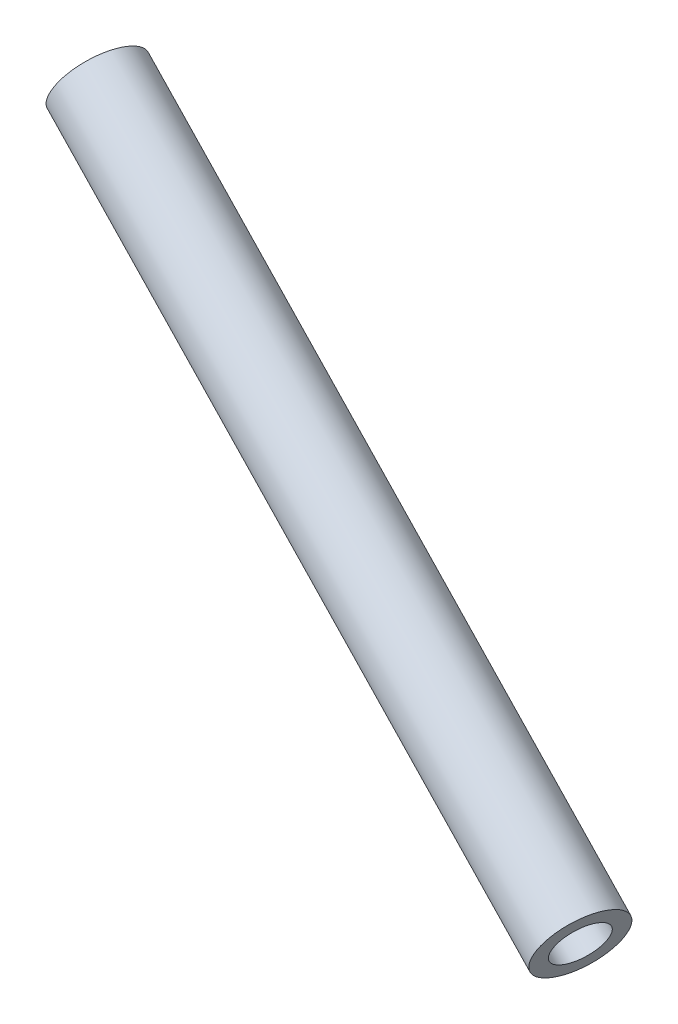
ISO-10303-21;
HEADER;
FILE_DESCRIPTION(('STEP AP214'),'2;1');
FILE_NAME('part.step','',(''),(''),'','','');
FILE_SCHEMA(('AUTOMOTIVE_DESIGN { 1 0 10303 214 1 1 1 1 }'));
ENDSEC;
DATA;
#1=APPLICATION_CONTEXT('core data for automotive mechanical design processes');
#2=APPLICATION_PROTOCOL_DEFINITION('international standard','automotive_design',2000,#1);
#3=PRODUCT_CONTEXT('',#1,'mechanical');
#4=PRODUCT('Part','Part','',(#3));
#5=PRODUCT_RELATED_PRODUCT_CATEGORY('part','',(#4));
#6=PRODUCT_DEFINITION_FORMATION('','',#4);
#7=PRODUCT_DEFINITION_CONTEXT('part definition',#1,'design');
#8=PRODUCT_DEFINITION('design','',#6,#7);
#9=PRODUCT_DEFINITION_SHAPE('','',#8);
#10=(LENGTH_UNIT() NAMED_UNIT(*) SI_UNIT(.MILLI.,.METRE.));
#11=(NAMED_UNIT(*) PLANE_ANGLE_UNIT() SI_UNIT($,.RADIAN.));
#12=(NAMED_UNIT(*) SI_UNIT($,.STERADIAN.) SOLID_ANGLE_UNIT());
#13=UNCERTAINTY_MEASURE_WITH_UNIT(LENGTH_MEASURE(1.E-05),#10,'distance_accuracy_value','');
#14=(GEOMETRIC_REPRESENTATION_CONTEXT(3) GLOBAL_UNCERTAINTY_ASSIGNED_CONTEXT((#13)) GLOBAL_UNIT_ASSIGNED_CONTEXT((#10,
#11,#12)) REPRESENTATION_CONTEXT('',''));
#15=CARTESIAN_POINT('',(0.,0.,0.));
#16=DIRECTION('',(0.,0.,1.));
#17=DIRECTION('',(1.,0.,0.));
#18=AXIS2_PLACEMENT_3D('',#15,#16,#17);
#19=CARTESIAN_POINT('',(-74.444753684597,97.0848251686542,-12.9025849114731));
#20=DIRECTION('',(0.869739963853115,-0.435019425763826,0.233046120939381));
#21=DIRECTION('',(-0.447336531418005,-0.894365712479469,0.));
#22=AXIS2_PLACEMENT_3D('',#19,#20,#21);
#23=CYLINDRICAL_SURFACE('',#22,2.5);
#24=CARTESIAN_POINT('',(-74.444753684597,97.0848251686542,-12.9025849114731));
#25=DIRECTION('',(0.869739963853115,-0.435019425763826,0.233046120939381));
#26=DIRECTION('',(0.447336531418005,0.894365712479469,0.));
#27=AXIS2_PLACEMENT_3D('',#24,#25,#26);
#28=CIRCLE('',#27,2.5);
#29=CARTESIAN_POINT('',(-73.326412356052,99.3207394498528,-12.9025849114731));
#30=VERTEX_POINT('',#29);
#31=EDGE_CURVE('E10',#30,#30,#28,.T.);
#32=ORIENTED_EDGE('',*,*,#31,.T.);
#33=EDGE_LOOP('',(#32));
#34=FACE_BOUND('',#33,.T.);
#35=CARTESIAN_POINT('',(-34.1193109206581,76.9151748318745,-2.09741508845444));
#36=DIRECTION('',(0.869739963853115,-0.435019425763826,0.233046120939381));
#37=DIRECTION('',(0.447336531418005,0.894365712479469,0.));
#38=AXIS2_PLACEMENT_3D('',#35,#36,#37);
#39=CIRCLE('',#38,2.5);
#40=CARTESIAN_POINT('',(-33.0009695921131,79.1510891130731,-2.09741508845444));
#41=VERTEX_POINT('',#40);
#42=EDGE_CURVE('E46',#41,#41,#39,.T.);
#43=ORIENTED_EDGE('',*,*,#42,.F.);
#44=EDGE_LOOP('',(#43));
#45=FACE_BOUND('',#44,.T.);
#46=ADVANCED_FACE('F39',(#34,#45),#23,.T.);
#47=CARTESIAN_POINT('',(-74.444753684597,97.0848251686542,-12.9025849114731));
#48=DIRECTION('',(-0.869739963853115,0.435019425763826,-0.233046120939381));
#49=DIRECTION('',(0.447336531418005,0.894365712479469,0.));
#50=AXIS2_PLACEMENT_3D('',#47,#48,#49);
#51=PLANE('',#50);
#52=CARTESIAN_POINT('',(-74.444753684597,97.0848251686542,-12.9025849114731));
#53=DIRECTION('',(0.869739963853115,-0.435019425763826,0.233046120939381));
#54=DIRECTION('',(0.447336531418005,0.894365712479469,0.));
#55=AXIS2_PLACEMENT_3D('',#52,#53,#54);
#56=CIRCLE('',#55,1.55);
#57=CARTESIAN_POINT('',(-75.1381253082949,95.698558314311,-12.9025849114731));
#58=VERTEX_POINT('',#57);
#59=EDGE_CURVE('E51',#58,#58,#56,.F.);
#60=ORIENTED_EDGE('',*,*,#59,.F.);
#61=EDGE_LOOP('',(#60));
#62=FACE_BOUND('',#61,.T.);
#63=ORIENTED_EDGE('',*,*,#31,.F.);
#64=EDGE_LOOP('',(#63));
#65=FACE_BOUND('',#64,.T.);
#66=ADVANCED_FACE('F70',(#62,#65),#51,.T.);
#67=CARTESIAN_POINT('',(-34.1193109206581,76.9151748318745,-2.09741508845444));
#68=DIRECTION('',(-0.869739963853115,0.435019425763826,-0.233046120939381));
#69=DIRECTION('',(0.447336531418005,0.894365712479469,0.));
#70=AXIS2_PLACEMENT_3D('',#67,#68,#69);
#71=PLANE('',#70);
#72=CARTESIAN_POINT('',(-34.1193109206581,76.9151748318745,-2.09741508845443));
#73=DIRECTION('',(0.869739963853115,-0.435019425763826,0.233046120939381));
#74=DIRECTION('',(0.447336531418005,0.894365712479469,0.));
#75=AXIS2_PLACEMENT_3D('',#72,#73,#74);
#76=CIRCLE('',#75,1.55);
#77=CARTESIAN_POINT('',(-34.812682544356,75.5289079775313,-2.09741508845443));
#78=VERTEX_POINT('',#77);
#79=EDGE_CURVE('E45',#78,#78,#76,.F.);
#80=ORIENTED_EDGE('',*,*,#79,.T.);
#81=EDGE_LOOP('',(#80));
#82=FACE_BOUND('',#81,.T.);
#83=ORIENTED_EDGE('',*,*,#42,.T.);
#84=EDGE_LOOP('',(#83));
#85=FACE_BOUND('',#84,.T.);
#86=ADVANCED_FACE('F56',(#82,#85),#71,.F.);
#87=CARTESIAN_POINT('',(-74.5317276809823,97.1283271112306,-12.925889523567));
#88=DIRECTION('',(0.869739963853115,-0.435019425763827,0.233046120939381));
#89=DIRECTION('',(-0.447336531418006,-0.894365712479469,0.));
#90=AXIS2_PLACEMENT_3D('',#87,#88,#89);
#91=CYLINDRICAL_SURFACE('',#90,1.55);
#92=CARTESIAN_POINT('',(-75.1381253082949,95.698558314311,-12.9025849114731));
#93=CARTESIAN_POINT('',(-74.7180686128372,95.4884577899696,-12.79003105915));
#94=CARTESIAN_POINT('',(-74.2980119173795,95.2783572656281,-12.6774772068268));
#95=CARTESIAN_POINT('',(-73.4578985264641,94.8581562169452,-12.4523695021806));
#96=CARTESIAN_POINT('',(-73.0378418310064,94.6480556926037,-12.3398156498575));
#97=CARTESIAN_POINT('',(-72.197728440091,94.2278546439208,-12.1147079452113));
#98=CARTESIAN_POINT('',(-71.7776717446333,94.0177541195794,-12.0021540928882));
#99=CARTESIAN_POINT('',(-70.9375583537179,93.5975530708965,-11.777046388242));
#100=CARTESIAN_POINT('',(-70.5175016582602,93.387452546555,-11.6644925359188));
#101=CARTESIAN_POINT('',(-69.6773882673449,92.9672514978721,-11.4393848312726));
#102=CARTESIAN_POINT('',(-69.2573315718871,92.7571509735306,-11.3268309789495));
#103=CARTESIAN_POINT('',(-68.4172181809718,92.3369499248477,-11.1017232743033));
#104=CARTESIAN_POINT('',(-67.997161485514,92.1268494005063,-10.9891694219802));
#105=CARTESIAN_POINT('',(-67.1570480945987,91.7066483518234,-10.764061717334));
#106=CARTESIAN_POINT('',(-66.736991399141,91.4965478274819,-10.6515078650108));
#107=CARTESIAN_POINT('',(-65.8968780082256,91.076346778799,-10.4264001603646));
#108=CARTESIAN_POINT('',(-65.4768213127679,90.8662462544575,-10.3138463080415));
#109=CARTESIAN_POINT('',(-64.6367079218525,90.4460452057746,-10.0887386033953));
#110=CARTESIAN_POINT('',(-64.2166512263948,90.2359446814332,-9.97618475107218));
#111=CARTESIAN_POINT('',(-63.3765378354794,89.8157436327503,-9.75107704642596));
#112=CARTESIAN_POINT('',(-62.9564811400217,89.6056431084088,-9.63852319410285));
#113=CARTESIAN_POINT('',(-62.1163677491063,89.1854420597259,-9.41341548945663));
#114=CARTESIAN_POINT('',(-61.6963110536486,88.9753415353844,-9.30086163713352));
#115=CARTESIAN_POINT('',(-60.8561976627332,88.5551404867015,-9.0757539324873));
#116=CARTESIAN_POINT('',(-60.4361409672755,88.3450399623601,-8.96320008016419));
#117=CARTESIAN_POINT('',(-59.5960275763601,87.9248389136772,-8.73809237551797));
#118=CARTESIAN_POINT('',(-59.1759708809024,87.7147383893357,-8.62553852319485));
#119=CARTESIAN_POINT('',(-58.335857489987,87.2945373406528,-8.40043081854863));
#120=CARTESIAN_POINT('',(-57.9158007945293,87.0844368163113,-8.28787696622552));
#121=CARTESIAN_POINT('',(-57.0756874036139,86.6642357676284,-8.0627692615793));
#122=CARTESIAN_POINT('',(-56.6556307081562,86.454135243287,-7.95021540925619));
#123=CARTESIAN_POINT('',(-55.8155173172408,86.0339341946041,-7.72510770460997));
#124=CARTESIAN_POINT('',(-55.3954606217831,85.8238336702626,-7.61255385228686));
#125=CARTESIAN_POINT('',(-54.5553472308677,85.4036326215797,-7.38744614764064));
#126=CARTESIAN_POINT('',(-54.13529053541,85.1935320972382,-7.27489229531753));
#127=CARTESIAN_POINT('',(-53.2951771444946,84.7733310485553,-7.0497845906713));
#128=CARTESIAN_POINT('',(-52.8751204490369,84.5632305242139,-6.93723073834819));
#129=CARTESIAN_POINT('',(-52.0350070581216,84.143029475531,-6.71212303370197));
#130=CARTESIAN_POINT('',(-51.6149503626639,83.9329289511895,-6.59956918137886));
#131=CARTESIAN_POINT('',(-50.7748369717485,83.5127279025066,-6.37446147673264));
#132=CARTESIAN_POINT('',(-50.3547802762908,83.3026273781651,-6.26190762440953));
#133=CARTESIAN_POINT('',(-49.5146668853754,82.8824263294822,-6.03679991976331));
#134=CARTESIAN_POINT('',(-49.0946101899177,82.6723258051408,-5.9242460674402));
#135=CARTESIAN_POINT('',(-48.2544967990023,82.2521247564579,-5.69913836279397));
#136=CARTESIAN_POINT('',(-47.8344401035446,82.0420242321164,-5.58658451047086));
#137=CARTESIAN_POINT('',(-46.9943267126292,81.6218231834335,-5.36147680582464));
#138=CARTESIAN_POINT('',(-46.5742700171715,81.411722659092,-5.24892295350153));
#139=CARTESIAN_POINT('',(-45.7341566262561,80.9915216104091,-5.02381524885531));
#140=CARTESIAN_POINT('',(-45.3140999307984,80.7814210860677,-4.9112613965322));
#141=CARTESIAN_POINT('',(-44.473986539883,80.3612200373848,-4.68615369188598));
#142=CARTESIAN_POINT('',(-44.0539298444253,80.1511195130433,-4.57359983956287));
#143=CARTESIAN_POINT('',(-43.2138164535099,79.7309184643604,-4.34849213491665));
#144=CARTESIAN_POINT('',(-42.7937597580522,79.5208179400189,-4.23593828259354));
#145=CARTESIAN_POINT('',(-41.9536463671368,79.100616891336,-4.01083057794731));
#146=CARTESIAN_POINT('',(-41.5335896716791,78.8905163669946,-3.8982767256242));
#147=CARTESIAN_POINT('',(-40.6934762807637,78.4703153183117,-3.67316902097798));
#148=CARTESIAN_POINT('',(-40.273419585306,78.2602147939702,-3.56061516865487));
#149=CARTESIAN_POINT('',(-39.4333061943906,77.8400137452873,-3.33550746400865));
#150=CARTESIAN_POINT('',(-39.0132494989329,77.6299132209458,-3.22295361168554));
#151=CARTESIAN_POINT('',(-38.1731361080175,77.2097121722629,-2.99784590703932));
#152=CARTESIAN_POINT('',(-37.7530794125598,76.9996116479215,-2.88529205471621));
#153=CARTESIAN_POINT('',(-36.9129660216445,76.5794105992386,-2.66018435006999));
#154=CARTESIAN_POINT('',(-36.4929093261867,76.3693100748971,-2.54763049774687));
#155=CARTESIAN_POINT('',(-35.6527959352714,75.9491090262142,-2.32252279310065));
#156=CARTESIAN_POINT('',(-35.2327392398137,75.7390085018727,-2.20996894077754));
#157=CARTESIAN_POINT('',(-34.812682544356,75.5289079775313,-2.09741508845443));
#158=B_SPLINE_CURVE_WITH_KNOTS('',3,(#92,#93,#94,#95,#96,#97,#98,#99,#100,#101,#102,#103,#104,
#105,#106,#107,#108,#109,#110,#111,#112,#113,#114,#115,#116,#117,#118,#119,#120,#121,#122,#123,
#124,#125,#126,#127,#128,#129,#130,#131,#132,#133,#134,#135,#136,#137,#138,#139,#140,#141,#142,
#143,#144,#145,#146,#147,#148,#149,#150,#151,#152,#153,#154,#155,#156,#157),.UNSPECIFIED.,.F.,
.F.,(4,2,2,2,2,2,2,2,2,2,2,2,2,2,2,2,2,2,2,2,2,2,2,2,2,2,2,2,2,2,2,2,4),(0.,1.44890442976807,
2.89780885953613,4.34671328930419,5.79561771907225,7.24452214884032,8.69342657860838,
10.1423310083764,11.5912354381445,13.0401398679126,14.4890442976806,15.9379487274487,
17.3868531572168,18.8357575869848,20.2846620167529,21.7335664465209,23.182470876289,
24.6313753060571,26.0802797358251,27.5291841655932,28.9780885953612,30.4269930251293,
31.8758974548974,33.3248018846654,34.7737063144335,36.2226107442016,37.6715151739696,
39.1204196037377,40.5693240335057,42.0182284632738,43.4671328930419,44.9160373228099,
46.364941752578),.UNSPECIFIED.);
#159=EDGE_CURVE('BSEAM62',#58,#78,#158,.T.);
#160=ORIENTED_EDGE('',*,*,#59,.T.);
#161=ORIENTED_EDGE('',*,*,#79,.F.);
#162=ORIENTED_EDGE('',*,*,#159,.T.);
#163=ORIENTED_EDGE('',*,*,#159,.F.);
#164=EDGE_LOOP('',(#160,#162,#161,#163));
#165=FACE_BOUND('',#164,.T.);
#166=ADVANCED_FACE('F62',(#165),#91,.F.);
#167=CLOSED_SHELL('',(#46,#66,#86,#166));
#168=MANIFOLD_SOLID_BREP('B2',#167);
#169=ADVANCED_BREP_SHAPE_REPRESENTATION('',(#18,#168),#14);
#170=SHAPE_DEFINITION_REPRESENTATION(#9,#169);
ENDSEC;
END-ISO-10303-21;
